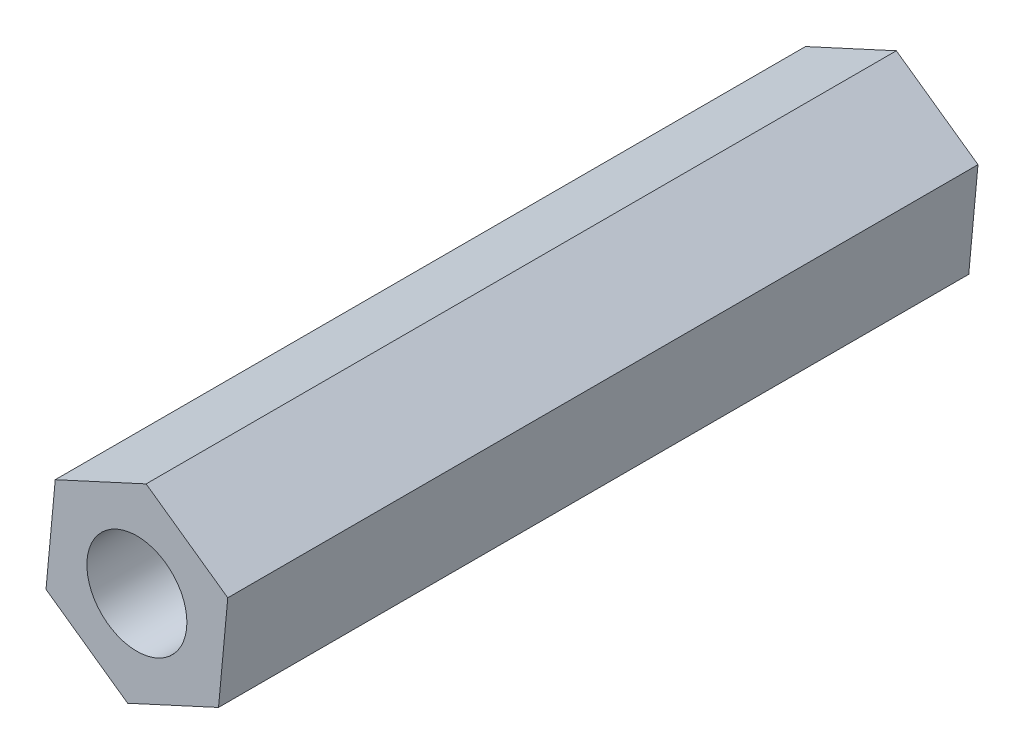
ISO-10303-21;
HEADER;
FILE_DESCRIPTION(('STEP AP214'),'2;1');
FILE_NAME('part.step','',(''),(''),'','','');
FILE_SCHEMA(('AUTOMOTIVE_DESIGN { 1 0 10303 214 1 1 1 1 }'));
ENDSEC;
DATA;
#1=APPLICATION_CONTEXT('core data for automotive mechanical design processes');
#2=APPLICATION_PROTOCOL_DEFINITION('international standard','automotive_design',2000,#1);
#3=PRODUCT_CONTEXT('',#1,'mechanical');
#4=PRODUCT('Part','Part','',(#3));
#5=PRODUCT_RELATED_PRODUCT_CATEGORY('part','',(#4));
#6=PRODUCT_DEFINITION_FORMATION('','',#4);
#7=PRODUCT_DEFINITION_CONTEXT('part definition',#1,'design');
#8=PRODUCT_DEFINITION('design','',#6,#7);
#9=PRODUCT_DEFINITION_SHAPE('','',#8);
#10=(LENGTH_UNIT() NAMED_UNIT(*) SI_UNIT(.MILLI.,.METRE.));
#11=(NAMED_UNIT(*) PLANE_ANGLE_UNIT() SI_UNIT($,.RADIAN.));
#12=(NAMED_UNIT(*) SI_UNIT($,.STERADIAN.) SOLID_ANGLE_UNIT());
#13=UNCERTAINTY_MEASURE_WITH_UNIT(LENGTH_MEASURE(1.E-05),#10,'distance_accuracy_value','');
#14=(GEOMETRIC_REPRESENTATION_CONTEXT(3) GLOBAL_UNCERTAINTY_ASSIGNED_CONTEXT((#13)) GLOBAL_UNIT_ASSIGNED_CONTEXT((#10,
#11,#12)) REPRESENTATION_CONTEXT('',''));
#15=CARTESIAN_POINT('',(0.,0.,0.));
#16=DIRECTION('',(0.,0.,1.));
#17=DIRECTION('',(1.,0.,0.));
#18=AXIS2_PLACEMENT_3D('',#15,#16,#17);
#19=CARTESIAN_POINT('',(0.,0.,30.));
#20=DIRECTION('',(0.,0.,1.));
#21=DIRECTION('',(1.,0.,0.));
#22=AXIS2_PLACEMENT_3D('',#19,#20,#21);
#23=PLANE('',#22);
#24=DIRECTION('',(-0.908540964677492,-0.417795782054932,0.));
#25=VECTOR('',#24,1.);
#26=CARTESIAN_POINT('',(3.31092038289479,-118.958255709686,30.));
#27=LINE('',#26,#25);
#28=CARTESIAN_POINT('',(3.31092038289479,-118.958255709686,30.));
#29=VERTEX_POINT('',#28);
#30=CARTESIAN_POINT('',(-0.32324347581518,-120.629438837906,30.));
#31=VERTEX_POINT('',#30);
#32=EDGE_CURVE('E131',#29,#31,#27,.T.);
#33=ORIENTED_EDGE('',*,*,#32,.T.);
#34=DIRECTION('',(-0.0924487214851821,-0.995717446816995,0.));
#35=VECTOR('',#34,1.);
#36=CARTESIAN_POINT('',(-0.32324347581518,-120.629438837906,30.));
#37=LINE('',#36,#35);
#38=CARTESIAN_POINT('',(-0.69303836175591,-124.612308625174,30.));
#39=VERTEX_POINT('',#38);
#40=EDGE_CURVE('E89',#31,#39,#37,.T.);
#41=ORIENTED_EDGE('',*,*,#40,.T.);
#42=DIRECTION('',(0.816092243192303,-0.577921664762064,0.));
#43=VECTOR('',#42,1.);
#44=CARTESIAN_POINT('',(-0.69303836175591,-124.612308625174,30.));
#45=LINE('',#44,#43);
#46=CARTESIAN_POINT('',(2.57133061101332,-126.923995284222,30.));
#47=VERTEX_POINT('',#46);
#48=EDGE_CURVE('E102',#39,#47,#45,.T.);
#49=ORIENTED_EDGE('',*,*,#48,.T.);
#50=DIRECTION('',(0.908540964677492,0.417795782054932,0.));
#51=VECTOR('',#50,1.);
#52=CARTESIAN_POINT('',(2.57133061101332,-126.923995284222,30.));
#53=LINE('',#52,#51);
#54=CARTESIAN_POINT('',(6.20549446972329,-125.252812156003,30.));
#55=VERTEX_POINT('',#54);
#56=EDGE_CURVE('E96',#47,#55,#53,.T.);
#57=ORIENTED_EDGE('',*,*,#56,.T.);
#58=DIRECTION('',(0.0924487214851817,0.995717446816995,0.));
#59=VECTOR('',#58,1.);
#60=CARTESIAN_POINT('',(6.20549446972329,-125.252812156003,30.));
#61=LINE('',#60,#59);
#62=CARTESIAN_POINT('',(6.57528935566402,-121.269942368735,30.));
#63=VERTEX_POINT('',#62);
#64=EDGE_CURVE('E100',#55,#63,#61,.T.);
#65=ORIENTED_EDGE('',*,*,#64,.T.);
#66=DIRECTION('',(-0.816092243192305,0.577921664762061,0.));
#67=VECTOR('',#66,1.);
#68=CARTESIAN_POINT('',(6.57528935566402,-121.269942368735,30.));
#69=LINE('',#68,#67);
#70=EDGE_CURVE('E52',#63,#29,#69,.T.);
#71=ORIENTED_EDGE('',*,*,#70,.T.);
#72=EDGE_LOOP('',(#33,#41,#49,#57,#65,#71));
#73=FACE_BOUND('',#72,.T.);
#74=CARTESIAN_POINT('',(2.94112549695405,-122.941125496954,30.));
#75=DIRECTION('',(0.,0.,1.));
#76=DIRECTION('',(1.,0.,0.));
#77=AXIS2_PLACEMENT_3D('',#74,#75,#76);
#78=CIRCLE('',#77,2.);
#79=CARTESIAN_POINT('',(4.94112549695405,-122.941125496954,30.));
#80=VERTEX_POINT('',#79);
#81=EDGE_CURVE('E124',#80,#80,#78,.T.);
#82=ORIENTED_EDGE('',*,*,#81,.F.);
#83=EDGE_LOOP('',(#82));
#84=FACE_BOUND('',#83,.T.);
#85=ADVANCED_FACE('F35',(#73,#84),#23,.T.);
#86=CARTESIAN_POINT('',(0.,0.,0.));
#87=DIRECTION('',(0.,0.,1.));
#88=DIRECTION('',(1.,0.,0.));
#89=AXIS2_PLACEMENT_3D('',#86,#87,#88);
#90=PLANE('',#89);
#91=DIRECTION('',(-0.908540964677492,-0.417795782054932,0.));
#92=VECTOR('',#91,1.);
#93=CARTESIAN_POINT('',(3.31092038289479,-118.958255709686,0.));
#94=LINE('',#93,#92);
#95=CARTESIAN_POINT('',(3.31092038289479,-118.958255709686,0.));
#96=VERTEX_POINT('',#95);
#97=CARTESIAN_POINT('',(-0.32324347581518,-120.629438837906,0.));
#98=VERTEX_POINT('',#97);
#99=EDGE_CURVE('E120',#96,#98,#94,.T.);
#100=ORIENTED_EDGE('',*,*,#99,.F.);
#101=DIRECTION('',(-0.816092243192305,0.577921664762061,0.));
#102=VECTOR('',#101,1.);
#103=CARTESIAN_POINT('',(6.57528935566402,-121.269942368735,0.));
#104=LINE('',#103,#102);
#105=CARTESIAN_POINT('',(6.57528935566402,-121.269942368735,0.));
#106=VERTEX_POINT('',#105);
#107=EDGE_CURVE('E81',#106,#96,#104,.T.);
#108=ORIENTED_EDGE('',*,*,#107,.F.);
#109=DIRECTION('',(0.0924487214851817,0.995717446816995,0.));
#110=VECTOR('',#109,1.);
#111=CARTESIAN_POINT('',(6.20549446972329,-125.252812156003,0.));
#112=LINE('',#111,#110);
#113=CARTESIAN_POINT('',(6.20549446972329,-125.252812156003,0.));
#114=VERTEX_POINT('',#113);
#115=EDGE_CURVE('E75',#114,#106,#112,.T.);
#116=ORIENTED_EDGE('',*,*,#115,.F.);
#117=DIRECTION('',(0.908540964677492,0.417795782054932,0.));
#118=VECTOR('',#117,1.);
#119=CARTESIAN_POINT('',(2.57133061101332,-126.923995284222,0.));
#120=LINE('',#119,#118);
#121=CARTESIAN_POINT('',(2.57133061101332,-126.923995284222,0.));
#122=VERTEX_POINT('',#121);
#123=EDGE_CURVE('E110',#122,#114,#120,.T.);
#124=ORIENTED_EDGE('',*,*,#123,.F.);
#125=DIRECTION('',(0.816092243192303,-0.577921664762064,0.));
#126=VECTOR('',#125,1.);
#127=CARTESIAN_POINT('',(-0.69303836175591,-124.612308625174,0.));
#128=LINE('',#127,#126);
#129=CARTESIAN_POINT('',(-0.69303836175591,-124.612308625174,0.));
#130=VERTEX_POINT('',#129);
#131=EDGE_CURVE('E126',#130,#122,#128,.T.);
#132=ORIENTED_EDGE('',*,*,#131,.F.);
#133=DIRECTION('',(-0.0924487214851821,-0.995717446816995,0.));
#134=VECTOR('',#133,1.);
#135=CARTESIAN_POINT('',(-0.32324347581518,-120.629438837906,0.));
#136=LINE('',#135,#134);
#137=EDGE_CURVE('E123',#98,#130,#136,.T.);
#138=ORIENTED_EDGE('',*,*,#137,.F.);
#139=EDGE_LOOP('',(#100,#108,#116,#124,#132,#138));
#140=FACE_BOUND('',#139,.T.);
#141=CARTESIAN_POINT('',(2.94112549695405,-122.941125496954,0.));
#142=DIRECTION('',(0.,0.,1.));
#143=DIRECTION('',(1.,0.,0.));
#144=AXIS2_PLACEMENT_3D('',#141,#142,#143);
#145=CIRCLE('',#144,2.);
#146=CARTESIAN_POINT('',(4.94112549695405,-122.941125496954,0.));
#147=VERTEX_POINT('',#146);
#148=EDGE_CURVE('E224',#147,#147,#145,.T.);
#149=ORIENTED_EDGE('',*,*,#148,.T.);
#150=EDGE_LOOP('',(#149));
#151=FACE_BOUND('',#150,.T.);
#152=ADVANCED_FACE('F140',(#140,#151),#90,.F.);
#153=CARTESIAN_POINT('',(3.31092038289479,-118.958255709686,30.));
#154=DIRECTION('',(0.417795782054932,-0.908540964677492,0.));
#155=DIRECTION('',(0.908540964677492,0.417795782054933,0.));
#156=AXIS2_PLACEMENT_3D('',#153,#154,#155);
#157=PLANE('',#156);
#158=ORIENTED_EDGE('',*,*,#99,.T.);
#159=DIRECTION('',(0.,0.,-1.));
#160=VECTOR('',#159,1.);
#161=CARTESIAN_POINT('',(-0.32324347581518,-120.629438837906,30.));
#162=LINE('',#161,#160);
#163=EDGE_CURVE('E11',#31,#98,#162,.T.);
#164=ORIENTED_EDGE('',*,*,#163,.F.);
#165=ORIENTED_EDGE('',*,*,#32,.F.);
#166=DIRECTION('',(0.,0.,-1.));
#167=VECTOR('',#166,1.);
#168=CARTESIAN_POINT('',(3.31092038289479,-118.958255709686,30.));
#169=LINE('',#168,#167);
#170=EDGE_CURVE('E116',#29,#96,#169,.T.);
#171=ORIENTED_EDGE('',*,*,#170,.T.);
#172=EDGE_LOOP('',(#158,#164,#165,#171));
#173=FACE_BOUND('',#172,.T.);
#174=ADVANCED_FACE('F37',(#173),#157,.F.);
#175=CARTESIAN_POINT('',(-0.32324347581518,-120.629438837906,30.));
#176=DIRECTION('',(0.995717446816995,-0.0924487214851821,0.));
#177=DIRECTION('',(0.0924487214851821,0.995717446816995,0.));
#178=AXIS2_PLACEMENT_3D('',#175,#176,#177);
#179=PLANE('',#178);
#180=ORIENTED_EDGE('',*,*,#137,.T.);
#181=DIRECTION('',(0.,0.,-1.));
#182=VECTOR('',#181,1.);
#183=CARTESIAN_POINT('',(-0.69303836175591,-124.612308625174,30.));
#184=LINE('',#183,#182);
#185=EDGE_CURVE('E44',#39,#130,#184,.T.);
#186=ORIENTED_EDGE('',*,*,#185,.F.);
#187=ORIENTED_EDGE('',*,*,#40,.F.);
#188=ORIENTED_EDGE('',*,*,#163,.T.);
#189=EDGE_LOOP('',(#180,#186,#187,#188));
#190=FACE_BOUND('',#189,.T.);
#191=ADVANCED_FACE('F165',(#190),#179,.F.);
#192=CARTESIAN_POINT('',(-0.69303836175591,-124.612308625174,30.));
#193=DIRECTION('',(0.577921664762064,0.816092243192303,0.));
#194=DIRECTION('',(-0.816092243192303,0.577921664762064,0.));
#195=AXIS2_PLACEMENT_3D('',#192,#193,#194);
#196=PLANE('',#195);
#197=ORIENTED_EDGE('',*,*,#131,.T.);
#198=DIRECTION('',(0.,0.,-1.));
#199=VECTOR('',#198,1.);
#200=CARTESIAN_POINT('',(2.57133061101332,-126.923995284222,30.));
#201=LINE('',#200,#199);
#202=EDGE_CURVE('E111',#47,#122,#201,.T.);
#203=ORIENTED_EDGE('',*,*,#202,.F.);
#204=ORIENTED_EDGE('',*,*,#48,.F.);
#205=ORIENTED_EDGE('',*,*,#185,.T.);
#206=EDGE_LOOP('',(#197,#203,#204,#205));
#207=FACE_BOUND('',#206,.T.);
#208=ADVANCED_FACE('F137',(#207),#196,.F.);
#209=CARTESIAN_POINT('',(2.57133061101332,-126.923995284222,30.));
#210=DIRECTION('',(-0.417795782054932,0.908540964677492,0.));
#211=DIRECTION('',(-0.908540964677492,-0.417795782054933,0.));
#212=AXIS2_PLACEMENT_3D('',#209,#210,#211);
#213=PLANE('',#212);
#214=ORIENTED_EDGE('',*,*,#123,.T.);
#215=DIRECTION('',(0.,0.,-1.));
#216=VECTOR('',#215,1.);
#217=CARTESIAN_POINT('',(6.20549446972329,-125.252812156003,30.));
#218=LINE('',#217,#216);
#219=EDGE_CURVE('E107',#55,#114,#218,.T.);
#220=ORIENTED_EDGE('',*,*,#219,.F.);
#221=ORIENTED_EDGE('',*,*,#56,.F.);
#222=ORIENTED_EDGE('',*,*,#202,.T.);
#223=EDGE_LOOP('',(#214,#220,#221,#222));
#224=FACE_BOUND('',#223,.T.);
#225=ADVANCED_FACE('F108',(#224),#213,.F.);
#226=CARTESIAN_POINT('',(6.20549446972329,-125.252812156003,30.));
#227=DIRECTION('',(-0.995717446816995,0.0924487214851817,0.));
#228=DIRECTION('',(-0.0924487214851817,-0.995717446816995,0.));
#229=AXIS2_PLACEMENT_3D('',#226,#227,#228);
#230=PLANE('',#229);
#231=ORIENTED_EDGE('',*,*,#115,.T.);
#232=DIRECTION('',(0.,0.,-1.));
#233=VECTOR('',#232,1.);
#234=CARTESIAN_POINT('',(6.57528935566402,-121.269942368735,30.));
#235=LINE('',#234,#233);
#236=EDGE_CURVE('E112',#63,#106,#235,.T.);
#237=ORIENTED_EDGE('',*,*,#236,.F.);
#238=ORIENTED_EDGE('',*,*,#64,.F.);
#239=ORIENTED_EDGE('',*,*,#219,.T.);
#240=EDGE_LOOP('',(#231,#237,#238,#239));
#241=FACE_BOUND('',#240,.T.);
#242=ADVANCED_FACE('F114',(#241),#230,.F.);
#243=CARTESIAN_POINT('',(6.57528935566402,-121.269942368735,30.));
#244=DIRECTION('',(-0.577921664762061,-0.816092243192304,0.));
#245=DIRECTION('',(0.816092243192305,-0.577921664762061,0.));
#246=AXIS2_PLACEMENT_3D('',#243,#244,#245);
#247=PLANE('',#246);
#248=ORIENTED_EDGE('',*,*,#107,.T.);
#249=ORIENTED_EDGE('',*,*,#170,.F.);
#250=ORIENTED_EDGE('',*,*,#70,.F.);
#251=ORIENTED_EDGE('',*,*,#236,.T.);
#252=EDGE_LOOP('',(#248,#249,#250,#251));
#253=FACE_BOUND('',#252,.T.);
#254=ADVANCED_FACE('F145',(#253),#247,.F.);
#255=CARTESIAN_POINT('',(2.94112549695405,-122.941125496954,30.));
#256=DIRECTION('',(0.,0.,-1.));
#257=DIRECTION('',(-1.,0.,0.));
#258=AXIS2_PLACEMENT_3D('',#255,#256,#257);
#259=CYLINDRICAL_SURFACE('',#258,2.);
#260=ORIENTED_EDGE('',*,*,#81,.T.);
#261=EDGE_LOOP('',(#260));
#262=FACE_BOUND('',#261,.T.);
#263=ORIENTED_EDGE('',*,*,#148,.F.);
#264=EDGE_LOOP('',(#263));
#265=FACE_BOUND('',#264,.T.);
#266=ADVANCED_FACE('F147',(#262,#265),#259,.F.);
#267=CLOSED_SHELL('',(#85,#152,#174,#191,#208,#225,#242,#254,#266));
#268=MANIFOLD_SOLID_BREP('B2',#267);
#269=ADVANCED_BREP_SHAPE_REPRESENTATION('',(#18,#268),#14);
#270=SHAPE_DEFINITION_REPRESENTATION(#9,#269);
ENDSEC;
END-ISO-10303-21;
